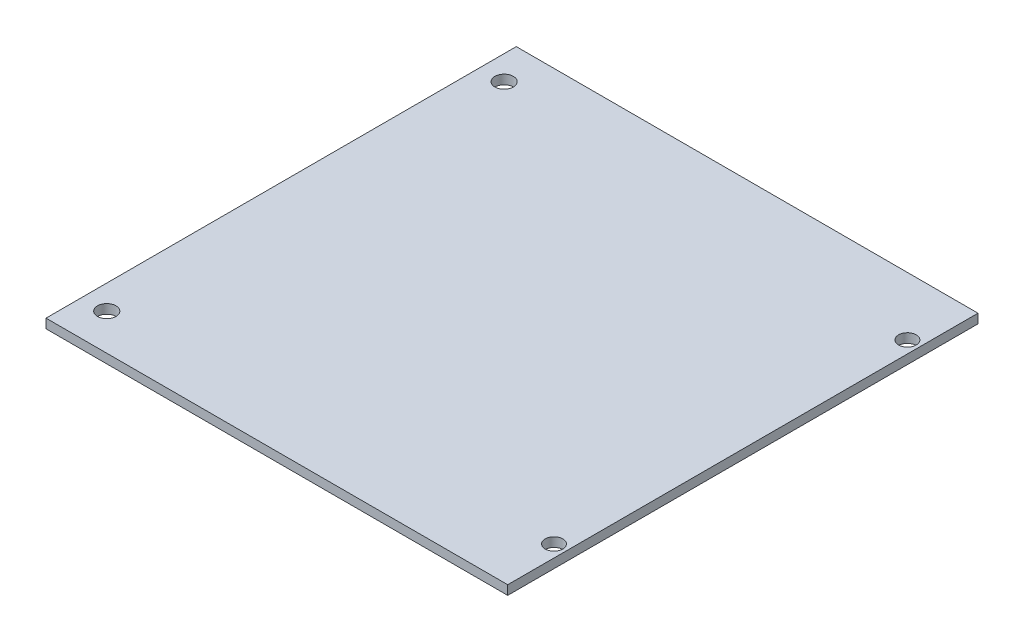
ISO-10303-21;
HEADER;
FILE_DESCRIPTION(('STEP AP214'),'2;1');
FILE_NAME('part.step','',(''),(''),'','','');
FILE_SCHEMA(('AUTOMOTIVE_DESIGN { 1 0 10303 214 1 1 1 1 }'));
ENDSEC;
DATA;
#1=APPLICATION_CONTEXT('core data for automotive mechanical design processes');
#2=APPLICATION_PROTOCOL_DEFINITION('international standard','automotive_design',2000,#1);
#3=PRODUCT_CONTEXT('',#1,'mechanical');
#4=PRODUCT('Part','Part','',(#3));
#5=PRODUCT_RELATED_PRODUCT_CATEGORY('part','',(#4));
#6=PRODUCT_DEFINITION_FORMATION('','',#4);
#7=PRODUCT_DEFINITION_CONTEXT('part definition',#1,'design');
#8=PRODUCT_DEFINITION('design','',#6,#7);
#9=PRODUCT_DEFINITION_SHAPE('','',#8);
#10=(LENGTH_UNIT() NAMED_UNIT(*) SI_UNIT(.MILLI.,.METRE.));
#11=(NAMED_UNIT(*) PLANE_ANGLE_UNIT() SI_UNIT($,.RADIAN.));
#12=(NAMED_UNIT(*) SI_UNIT($,.STERADIAN.) SOLID_ANGLE_UNIT());
#13=UNCERTAINTY_MEASURE_WITH_UNIT(LENGTH_MEASURE(1.E-05),#10,'distance_accuracy_value','');
#14=(GEOMETRIC_REPRESENTATION_CONTEXT(3) GLOBAL_UNCERTAINTY_ASSIGNED_CONTEXT((#13)) GLOBAL_UNIT_ASSIGNED_CONTEXT((#10,
#11,#12)) REPRESENTATION_CONTEXT('',''));
#15=CARTESIAN_POINT('',(0.,0.,0.));
#16=DIRECTION('',(0.,0.,1.));
#17=DIRECTION('',(1.,0.,0.));
#18=AXIS2_PLACEMENT_3D('',#15,#16,#17);
#19=CARTESIAN_POINT('',(-71.8575234229718,1.600000102,79.0505329153605));
#20=DIRECTION('',(1.,0.,0.));
#21=DIRECTION('',(0.,0.,-1.));
#22=AXIS2_PLACEMENT_3D('',#19,#20,#21);
#23=PLANE('',#22);
#24=DIRECTION('',(0.,0.,1.));
#25=VECTOR('',#24,1.);
#26=CARTESIAN_POINT('',(-71.8575234229718,0.,79.0505329153605));
#27=LINE('',#26,#25);
#28=CARTESIAN_POINT('',(-71.8575234229718,0.,-2.22946708463949));
#29=VERTEX_POINT('',#28);
#30=CARTESIAN_POINT('',(-71.8575234229718,0.,79.0505329153605));
#31=VERTEX_POINT('',#30);
#32=EDGE_CURVE('E97',#29,#31,#27,.T.);
#33=ORIENTED_EDGE('',*,*,#32,.T.);
#34=DIRECTION('',(0.,-1.,0.));
#35=VECTOR('',#34,1.);
#36=CARTESIAN_POINT('',(-71.8575234229718,1.600000102,79.0505329153605));
#37=LINE('',#36,#35);
#38=CARTESIAN_POINT('',(-71.8575234229718,1.600000102,79.0505329153605));
#39=VERTEX_POINT('',#38);
#40=EDGE_CURVE('E11',#39,#31,#37,.T.);
#41=ORIENTED_EDGE('',*,*,#40,.F.);
#42=DIRECTION('',(0.,0.,1.));
#43=VECTOR('',#42,1.);
#44=CARTESIAN_POINT('',(-71.8575234229718,1.600000102,79.0505329153605));
#45=LINE('',#44,#43);
#46=CARTESIAN_POINT('',(-71.8575234229718,1.600000102,-2.22946708463949));
#47=VERTEX_POINT('',#46);
#48=EDGE_CURVE('E85',#47,#39,#45,.T.);
#49=ORIENTED_EDGE('',*,*,#48,.F.);
#50=DIRECTION('',(0.,-1.,0.));
#51=VECTOR('',#50,1.);
#52=CARTESIAN_POINT('',(-71.8575234229718,1.600000102,-2.22946708463949));
#53=LINE('',#52,#51);
#54=EDGE_CURVE('E93',#47,#29,#53,.T.);
#55=ORIENTED_EDGE('',*,*,#54,.T.);
#56=EDGE_LOOP('',(#33,#41,#49,#55));
#57=FACE_BOUND('',#56,.T.);
#58=ADVANCED_FACE('F34',(#57),#23,.F.);
#59=CARTESIAN_POINT('',(-71.8575234229718,1.600000102,79.0505329153605));
#60=DIRECTION('',(0.,0.,-1.));
#61=DIRECTION('',(-1.,0.,0.));
#62=AXIS2_PLACEMENT_3D('',#59,#60,#61);
#63=PLANE('',#62);
#64=DIRECTION('',(1.,0.,0.));
#65=VECTOR('',#64,1.);
#66=CARTESIAN_POINT('',(-71.8575234229718,0.,79.0505329153605));
#67=LINE('',#66,#65);
#68=CARTESIAN_POINT('',(7.9424764890282,0.,79.0505329153605));
#69=VERTEX_POINT('',#68);
#70=EDGE_CURVE('E89',#31,#69,#67,.T.);
#71=ORIENTED_EDGE('',*,*,#70,.T.);
#72=DIRECTION('',(0.,-1.,0.));
#73=VECTOR('',#72,1.);
#74=CARTESIAN_POINT('',(7.9424764890282,1.600000102,79.0505329153605));
#75=LINE('',#74,#73);
#76=CARTESIAN_POINT('',(7.9424764890282,1.600000102,79.0505329153605));
#77=VERTEX_POINT('',#76);
#78=EDGE_CURVE('E42',#77,#69,#75,.T.);
#79=ORIENTED_EDGE('',*,*,#78,.F.);
#80=DIRECTION('',(1.,0.,0.));
#81=VECTOR('',#80,1.);
#82=CARTESIAN_POINT('',(-71.8575234229718,1.600000102,79.0505329153605));
#83=LINE('',#82,#81);
#84=EDGE_CURVE('E80',#39,#77,#83,.T.);
#85=ORIENTED_EDGE('',*,*,#84,.F.);
#86=ORIENTED_EDGE('',*,*,#40,.T.);
#87=EDGE_LOOP('',(#71,#79,#85,#86));
#88=FACE_BOUND('',#87,.T.);
#89=ADVANCED_FACE('F88',(#88),#63,.F.);
#90=CARTESIAN_POINT('',(7.9424764890282,1.600000102,79.0505329153605));
#91=DIRECTION('',(-1.,0.,0.));
#92=DIRECTION('',(0.,0.,1.));
#93=AXIS2_PLACEMENT_3D('',#90,#91,#92);
#94=PLANE('',#93);
#95=DIRECTION('',(0.,0.,-1.));
#96=VECTOR('',#95,1.);
#97=CARTESIAN_POINT('',(7.9424764890282,0.,79.0505329153605));
#98=LINE('',#97,#96);
#99=CARTESIAN_POINT('',(7.9424764890282,0.,-2.22946708463949));
#100=VERTEX_POINT('',#99);
#101=EDGE_CURVE('E67',#69,#100,#98,.T.);
#102=ORIENTED_EDGE('',*,*,#101,.T.);
#103=DIRECTION('',(0.,-1.,0.));
#104=VECTOR('',#103,1.);
#105=CARTESIAN_POINT('',(7.9424764890282,1.600000102,-2.22946708463949));
#106=LINE('',#105,#104);
#107=CARTESIAN_POINT('',(7.9424764890282,1.600000102,-2.22946708463949));
#108=VERTEX_POINT('',#107);
#109=EDGE_CURVE('E90',#108,#100,#106,.T.);
#110=ORIENTED_EDGE('',*,*,#109,.F.);
#111=DIRECTION('',(0.,0.,-1.));
#112=VECTOR('',#111,1.);
#113=CARTESIAN_POINT('',(7.9424764890282,1.600000102,79.0505329153605));
#114=LINE('',#113,#112);
#115=EDGE_CURVE('E83',#77,#108,#114,.T.);
#116=ORIENTED_EDGE('',*,*,#115,.F.);
#117=ORIENTED_EDGE('',*,*,#78,.T.);
#118=EDGE_LOOP('',(#102,#110,#116,#117));
#119=FACE_BOUND('',#118,.T.);
#120=ADVANCED_FACE('F91',(#119),#94,.F.);
#121=CARTESIAN_POINT('',(-71.8575234229718,1.600000102,-2.22946708463949));
#122=DIRECTION('',(0.,0.,1.));
#123=DIRECTION('',(1.,0.,0.));
#124=AXIS2_PLACEMENT_3D('',#121,#122,#123);
#125=PLANE('',#124);
#126=DIRECTION('',(-1.,0.,0.));
#127=VECTOR('',#126,1.);
#128=CARTESIAN_POINT('',(-71.8575234229718,0.,-2.22946708463949));
#129=LINE('',#128,#127);
#130=EDGE_CURVE('E73',#100,#29,#129,.T.);
#131=ORIENTED_EDGE('',*,*,#130,.T.);
#132=ORIENTED_EDGE('',*,*,#54,.F.);
#133=DIRECTION('',(-1.,0.,0.));
#134=VECTOR('',#133,1.);
#135=CARTESIAN_POINT('',(-71.8575234229718,1.600000102,-2.22946708463949));
#136=LINE('',#135,#134);
#137=EDGE_CURVE('E50',#108,#47,#136,.T.);
#138=ORIENTED_EDGE('',*,*,#137,.F.);
#139=ORIENTED_EDGE('',*,*,#109,.T.);
#140=EDGE_LOOP('',(#131,#132,#138,#139));
#141=FACE_BOUND('',#140,.T.);
#142=ADVANCED_FACE('F105',(#141),#125,.F.);
#143=CARTESIAN_POINT('',(0.,1.600000102,0.));
#144=DIRECTION('',(0.,-1.,0.));
#145=DIRECTION('',(0.,0.,-1.));
#146=AXIS2_PLACEMENT_3D('',#143,#144,#145);
#147=PLANE('',#146);
#148=CARTESIAN_POINT('',(-67.6575282229718,1.600000102,4.07053291536051));
#149=DIRECTION('',(0.,1.,0.));
#150=DIRECTION('',(0.,0.,1.));
#151=AXIS2_PLACEMENT_3D('',#148,#149,#150);
#152=CIRCLE('',#151,1.60000000000001);
#153=CARTESIAN_POINT('',(-67.6575282229718,1.600000102,2.47053291536051));
#154=VERTEX_POINT('',#153);
#155=EDGE_CURVE('E126',#154,#154,#152,.T.);
#156=ORIENTED_EDGE('',*,*,#155,.F.);
#157=EDGE_LOOP('',(#156));
#158=FACE_BOUND('',#157,.T.);
#159=CARTESIAN_POINT('',(-67.6575282229718,1.600000102,72.7505329153605));
#160=DIRECTION('',(0.,-1.,0.));
#161=DIRECTION('',(0.,0.,-1.));
#162=AXIS2_PLACEMENT_3D('',#159,#160,#161);
#163=CIRCLE('',#162,1.60000000000001);
#164=CARTESIAN_POINT('',(-67.6575282229718,1.600000102,71.1505329153605));
#165=VERTEX_POINT('',#164);
#166=EDGE_CURVE('E120',#165,#165,#163,.T.);
#167=ORIENTED_EDGE('',*,*,#166,.T.);
#168=EDGE_LOOP('',(#167));
#169=FACE_BOUND('',#168,.T.);
#170=CARTESIAN_POINT('',(5.8424764890282,1.600000102,7.87053291536051));
#171=DIRECTION('',(0.,-1.,0.));
#172=DIRECTION('',(0.,0.,-1.));
#173=AXIS2_PLACEMENT_3D('',#170,#171,#172);
#174=CIRCLE('',#173,1.524);
#175=CARTESIAN_POINT('',(5.8424764890282,1.600000102,9.39453291536051));
#176=VERTEX_POINT('',#175);
#177=EDGE_CURVE('E117',#176,#176,#174,.T.);
#178=ORIENTED_EDGE('',*,*,#177,.T.);
#179=EDGE_LOOP('',(#178));
#180=FACE_BOUND('',#179,.T.);
#181=CARTESIAN_POINT('',(5.8424764890282,1.600000102,68.9505329153605));
#182=DIRECTION('',(0.,1.,0.));
#183=DIRECTION('',(0.,0.,1.));
#184=AXIS2_PLACEMENT_3D('',#181,#182,#183);
#185=CIRCLE('',#184,1.524);
#186=CARTESIAN_POINT('',(5.8424764890282,1.600000102,70.4745329153605));
#187=VERTEX_POINT('',#186);
#188=EDGE_CURVE('E111',#187,#187,#185,.T.);
#189=ORIENTED_EDGE('',*,*,#188,.F.);
#190=EDGE_LOOP('',(#189));
#191=FACE_BOUND('',#190,.T.);
#192=ORIENTED_EDGE('',*,*,#48,.T.);
#193=ORIENTED_EDGE('',*,*,#84,.T.);
#194=ORIENTED_EDGE('',*,*,#115,.T.);
#195=ORIENTED_EDGE('',*,*,#137,.T.);
#196=EDGE_LOOP('',(#192,#193,#194,#195));
#197=FACE_BOUND('',#196,.T.);
#198=ADVANCED_FACE('F81',(#158,#169,#180,#191,#197),#147,.F.);
#199=CARTESIAN_POINT('',(0.,0.,0.));
#200=DIRECTION('',(0.,-1.,0.));
#201=DIRECTION('',(0.,0.,-1.));
#202=AXIS2_PLACEMENT_3D('',#199,#200,#201);
#203=PLANE('',#202);
#204=CARTESIAN_POINT('',(-67.6575282229718,0.,4.07053291536051));
#205=DIRECTION('',(0.,1.,0.));
#206=DIRECTION('',(0.,0.,1.));
#207=AXIS2_PLACEMENT_3D('',#204,#205,#206);
#208=CIRCLE('',#207,1.60000000000001);
#209=CARTESIAN_POINT('',(-67.6575282229718,0.,2.47053291536051));
#210=VERTEX_POINT('',#209);
#211=EDGE_CURVE('E129',#210,#210,#208,.T.);
#212=ORIENTED_EDGE('',*,*,#211,.T.);
#213=EDGE_LOOP('',(#212));
#214=FACE_BOUND('',#213,.T.);
#215=CARTESIAN_POINT('',(-67.6575282229718,0.,72.7505329153605));
#216=DIRECTION('',(0.,-1.,0.));
#217=DIRECTION('',(0.,0.,-1.));
#218=AXIS2_PLACEMENT_3D('',#215,#216,#217);
#219=CIRCLE('',#218,1.60000000000001);
#220=CARTESIAN_POINT('',(-67.6575282229718,0.,71.1505329153605));
#221=VERTEX_POINT('',#220);
#222=EDGE_CURVE('E123',#221,#221,#219,.T.);
#223=ORIENTED_EDGE('',*,*,#222,.F.);
#224=EDGE_LOOP('',(#223));
#225=FACE_BOUND('',#224,.T.);
#226=CARTESIAN_POINT('',(5.8424764890282,0.,7.87053291536051));
#227=DIRECTION('',(0.,-1.,0.));
#228=DIRECTION('',(0.,0.,-1.));
#229=AXIS2_PLACEMENT_3D('',#226,#227,#228);
#230=CIRCLE('',#229,1.524);
#231=CARTESIAN_POINT('',(5.8424764890282,0.,9.39453291536051));
#232=VERTEX_POINT('',#231);
#233=EDGE_CURVE('E114',#232,#232,#230,.T.);
#234=ORIENTED_EDGE('',*,*,#233,.F.);
#235=EDGE_LOOP('',(#234));
#236=FACE_BOUND('',#235,.T.);
#237=CARTESIAN_POINT('',(5.8424764890282,0.,68.9505329153605));
#238=DIRECTION('',(0.,1.,0.));
#239=DIRECTION('',(0.,0.,1.));
#240=AXIS2_PLACEMENT_3D('',#237,#238,#239);
#241=CIRCLE('',#240,1.524);
#242=CARTESIAN_POINT('',(5.8424764890282,0.,70.4745329153605));
#243=VERTEX_POINT('',#242);
#244=EDGE_CURVE('E100',#243,#243,#241,.T.);
#245=ORIENTED_EDGE('',*,*,#244,.T.);
#246=EDGE_LOOP('',(#245));
#247=FACE_BOUND('',#246,.T.);
#248=ORIENTED_EDGE('',*,*,#32,.F.);
#249=ORIENTED_EDGE('',*,*,#130,.F.);
#250=ORIENTED_EDGE('',*,*,#101,.F.);
#251=ORIENTED_EDGE('',*,*,#70,.F.);
#252=EDGE_LOOP('',(#248,#249,#250,#251));
#253=FACE_BOUND('',#252,.T.);
#254=ADVANCED_FACE('F108',(#214,#225,#236,#247,#253),#203,.T.);
#255=CARTESIAN_POINT('',(5.8424764890282,0.,68.9505329153605));
#256=DIRECTION('',(0.,1.,0.));
#257=DIRECTION('',(0.,0.,1.));
#258=AXIS2_PLACEMENT_3D('',#255,#256,#257);
#259=CYLINDRICAL_SURFACE('',#258,1.524);
#260=CARTESIAN_POINT('',(5.8424764890282,0.,70.4745329153605));
#261=CARTESIAN_POINT('',(5.8424764890282,0.0166666677291667,70.4745329153605));
#262=CARTESIAN_POINT('',(5.8424764890282,0.0333333354583333,70.4745329153605));
#263=CARTESIAN_POINT('',(5.8424764890282,0.0666666709166667,70.4745329153605));
#264=CARTESIAN_POINT('',(5.8424764890282,0.0833333386458333,70.4745329153605));
#265=CARTESIAN_POINT('',(5.8424764890282,0.116666674104167,70.4745329153605));
#266=CARTESIAN_POINT('',(5.8424764890282,0.133333341833333,70.4745329153605));
#267=CARTESIAN_POINT('',(5.8424764890282,0.166666677291667,70.4745329153605));
#268=CARTESIAN_POINT('',(5.8424764890282,0.183333345020833,70.4745329153605));
#269=CARTESIAN_POINT('',(5.8424764890282,0.216666680479167,70.4745329153605));
#270=CARTESIAN_POINT('',(5.8424764890282,0.233333348208333,70.4745329153605));
#271=CARTESIAN_POINT('',(5.8424764890282,0.266666683666667,70.4745329153605));
#272=CARTESIAN_POINT('',(5.8424764890282,0.283333351395833,70.4745329153605));
#273=CARTESIAN_POINT('',(5.8424764890282,0.316666686854167,70.4745329153605));
#274=CARTESIAN_POINT('',(5.8424764890282,0.333333354583333,70.4745329153605));
#275=CARTESIAN_POINT('',(5.8424764890282,0.366666690041667,70.4745329153605));
#276=CARTESIAN_POINT('',(5.8424764890282,0.383333357770833,70.4745329153605));
#277=CARTESIAN_POINT('',(5.8424764890282,0.416666693229167,70.4745329153605));
#278=CARTESIAN_POINT('',(5.8424764890282,0.433333360958333,70.4745329153605));
#279=CARTESIAN_POINT('',(5.8424764890282,0.466666696416667,70.4745329153605));
#280=CARTESIAN_POINT('',(5.8424764890282,0.483333364145833,70.4745329153605));
#281=CARTESIAN_POINT('',(5.8424764890282,0.516666699604167,70.4745329153605));
#282=CARTESIAN_POINT('',(5.8424764890282,0.533333367333333,70.4745329153605));
#283=CARTESIAN_POINT('',(5.8424764890282,0.566666702791667,70.4745329153605));
#284=CARTESIAN_POINT('',(5.8424764890282,0.583333370520833,70.4745329153605));
#285=CARTESIAN_POINT('',(5.8424764890282,0.616666705979167,70.4745329153605));
#286=CARTESIAN_POINT('',(5.8424764890282,0.633333373708333,70.4745329153605));
#287=CARTESIAN_POINT('',(5.8424764890282,0.666666709166667,70.4745329153605));
#288=CARTESIAN_POINT('',(5.8424764890282,0.683333376895833,70.4745329153605));
#289=CARTESIAN_POINT('',(5.8424764890282,0.716666712354167,70.4745329153605));
#290=CARTESIAN_POINT('',(5.8424764890282,0.733333380083333,70.4745329153605));
#291=CARTESIAN_POINT('',(5.8424764890282,0.766666715541667,70.4745329153605));
#292=CARTESIAN_POINT('',(5.8424764890282,0.783333383270833,70.4745329153605));
#293=CARTESIAN_POINT('',(5.8424764890282,0.816666718729167,70.4745329153605));
#294=CARTESIAN_POINT('',(5.8424764890282,0.833333386458333,70.4745329153605));
#295=CARTESIAN_POINT('',(5.8424764890282,0.866666721916666,70.4745329153605));
#296=CARTESIAN_POINT('',(5.8424764890282,0.883333389645833,70.4745329153605));
#297=CARTESIAN_POINT('',(5.8424764890282,0.916666725104166,70.4745329153605));
#298=CARTESIAN_POINT('',(5.8424764890282,0.933333392833333,70.4745329153605));
#299=CARTESIAN_POINT('',(5.8424764890282,0.966666728291666,70.4745329153605));
#300=CARTESIAN_POINT('',(5.8424764890282,0.983333396020833,70.4745329153605));
#301=CARTESIAN_POINT('',(5.8424764890282,1.01666673147917,70.4745329153605));
#302=CARTESIAN_POINT('',(5.8424764890282,1.03333339920833,70.4745329153605));
#303=CARTESIAN_POINT('',(5.8424764890282,1.06666673466667,70.4745329153605));
#304=CARTESIAN_POINT('',(5.8424764890282,1.08333340239583,70.4745329153605));
#305=CARTESIAN_POINT('',(5.8424764890282,1.11666673785417,70.4745329153605));
#306=CARTESIAN_POINT('',(5.8424764890282,1.13333340558333,70.4745329153605));
#307=CARTESIAN_POINT('',(5.8424764890282,1.16666674104167,70.4745329153605));
#308=CARTESIAN_POINT('',(5.8424764890282,1.18333340877083,70.4745329153605));
#309=CARTESIAN_POINT('',(5.8424764890282,1.21666674422917,70.4745329153605));
#310=CARTESIAN_POINT('',(5.8424764890282,1.23333341195833,70.4745329153605));
#311=CARTESIAN_POINT('',(5.8424764890282,1.26666674741667,70.4745329153605));
#312=CARTESIAN_POINT('',(5.8424764890282,1.28333341514583,70.4745329153605));
#313=CARTESIAN_POINT('',(5.8424764890282,1.31666675060417,70.4745329153605));
#314=CARTESIAN_POINT('',(5.8424764890282,1.33333341833333,70.4745329153605));
#315=CARTESIAN_POINT('',(5.8424764890282,1.36666675379167,70.4745329153605));
#316=CARTESIAN_POINT('',(5.8424764890282,1.38333342152083,70.4745329153605));
#317=CARTESIAN_POINT('',(5.8424764890282,1.41666675697917,70.4745329153605));
#318=CARTESIAN_POINT('',(5.8424764890282,1.43333342470833,70.4745329153605));
#319=CARTESIAN_POINT('',(5.8424764890282,1.46666676016667,70.4745329153605));
#320=CARTESIAN_POINT('',(5.8424764890282,1.48333342789583,70.4745329153605));
#321=CARTESIAN_POINT('',(5.8424764890282,1.51666676335417,70.4745329153605));
#322=CARTESIAN_POINT('',(5.8424764890282,1.53333343108333,70.4745329153605));
#323=CARTESIAN_POINT('',(5.8424764890282,1.56666676654167,70.4745329153605));
#324=CARTESIAN_POINT('',(5.8424764890282,1.58333343427083,70.4745329153605));
#325=CARTESIAN_POINT('',(5.8424764890282,1.600000102,70.4745329153605));
#326=B_SPLINE_CURVE_WITH_KNOTS('',3,(#260,#261,#262,#263,#264,#265,#266,#267,#268,#269,#270,
#271,#272,#273,#274,#275,#276,#277,#278,#279,#280,#281,#282,#283,#284,#285,#286,#287,#288,#289,
#290,#291,#292,#293,#294,#295,#296,#297,#298,#299,#300,#301,#302,#303,#304,#305,#306,#307,#308,
#309,#310,#311,#312,#313,#314,#315,#316,#317,#318,#319,#320,#321,#322,#323,#324,#325),
.UNSPECIFIED.,.F.,.F.,(4,2,2,2,2,2,2,2,2,2,2,2,2,2,2,2,2,2,2,2,2,2,2,2,2,2,2,2,2,2,2,2,4),(0.,
0.0500000031875,0.100000006375,0.1500000095625,0.20000001275,0.2500000159375,0.300000019125,
0.3500000223125,0.4000000255,0.4500000286875,0.500000031875,0.5500000350625,0.60000003825,
0.6500000414375,0.700000044625,0.7500000478125,0.800000051,0.8500000541875,0.900000057375,
0.9500000605625,1.00000006375,1.0500000669375,1.100000070125,1.1500000733125,1.2000000765,
1.2500000796875,1.300000082875,1.3500000860625,1.40000008925,1.4500000924375,1.500000095625,
1.5500000988125,1.600000102),.UNSPECIFIED.);
#327=EDGE_CURVE('BSEAM147',#243,#187,#326,.T.);
#328=ORIENTED_EDGE('',*,*,#244,.F.);
#329=ORIENTED_EDGE('',*,*,#188,.T.);
#330=ORIENTED_EDGE('',*,*,#327,.T.);
#331=ORIENTED_EDGE('',*,*,#327,.F.);
#332=EDGE_LOOP('',(#328,#330,#329,#331));
#333=FACE_BOUND('',#332,.T.);
#334=ADVANCED_FACE('F147',(#333),#259,.F.);
#335=CARTESIAN_POINT('',(5.8424764890282,0.,7.87053291536051));
#336=DIRECTION('',(0.,1.,0.));
#337=DIRECTION('',(0.,0.,1.));
#338=AXIS2_PLACEMENT_3D('',#335,#336,#337);
#339=CYLINDRICAL_SURFACE('',#338,1.524);
#340=CARTESIAN_POINT('',(5.8424764890282,0.,9.39453291536051));
#341=CARTESIAN_POINT('',(5.8424764890282,0.0166666677291667,9.39453291536051));
#342=CARTESIAN_POINT('',(5.8424764890282,0.0333333354583333,9.39453291536051));
#343=CARTESIAN_POINT('',(5.8424764890282,0.0666666709166667,9.39453291536051));
#344=CARTESIAN_POINT('',(5.8424764890282,0.0833333386458333,9.39453291536051));
#345=CARTESIAN_POINT('',(5.8424764890282,0.116666674104167,9.39453291536051));
#346=CARTESIAN_POINT('',(5.8424764890282,0.133333341833333,9.39453291536051));
#347=CARTESIAN_POINT('',(5.8424764890282,0.166666677291667,9.39453291536051));
#348=CARTESIAN_POINT('',(5.8424764890282,0.183333345020833,9.39453291536051));
#349=CARTESIAN_POINT('',(5.8424764890282,0.216666680479167,9.39453291536051));
#350=CARTESIAN_POINT('',(5.8424764890282,0.233333348208333,9.39453291536051));
#351=CARTESIAN_POINT('',(5.8424764890282,0.266666683666667,9.39453291536051));
#352=CARTESIAN_POINT('',(5.8424764890282,0.283333351395833,9.39453291536051));
#353=CARTESIAN_POINT('',(5.8424764890282,0.316666686854167,9.39453291536051));
#354=CARTESIAN_POINT('',(5.8424764890282,0.333333354583333,9.39453291536051));
#355=CARTESIAN_POINT('',(5.8424764890282,0.366666690041667,9.39453291536051));
#356=CARTESIAN_POINT('',(5.8424764890282,0.383333357770833,9.39453291536051));
#357=CARTESIAN_POINT('',(5.8424764890282,0.416666693229167,9.39453291536051));
#358=CARTESIAN_POINT('',(5.8424764890282,0.433333360958333,9.39453291536051));
#359=CARTESIAN_POINT('',(5.8424764890282,0.466666696416667,9.39453291536051));
#360=CARTESIAN_POINT('',(5.8424764890282,0.483333364145833,9.39453291536051));
#361=CARTESIAN_POINT('',(5.8424764890282,0.516666699604167,9.39453291536051));
#362=CARTESIAN_POINT('',(5.8424764890282,0.533333367333333,9.39453291536051));
#363=CARTESIAN_POINT('',(5.8424764890282,0.566666702791667,9.39453291536051));
#364=CARTESIAN_POINT('',(5.8424764890282,0.583333370520833,9.39453291536051));
#365=CARTESIAN_POINT('',(5.8424764890282,0.616666705979167,9.39453291536051));
#366=CARTESIAN_POINT('',(5.8424764890282,0.633333373708333,9.39453291536051));
#367=CARTESIAN_POINT('',(5.8424764890282,0.666666709166667,9.39453291536051));
#368=CARTESIAN_POINT('',(5.8424764890282,0.683333376895833,9.39453291536051));
#369=CARTESIAN_POINT('',(5.8424764890282,0.716666712354167,9.39453291536051));
#370=CARTESIAN_POINT('',(5.8424764890282,0.733333380083333,9.39453291536051));
#371=CARTESIAN_POINT('',(5.8424764890282,0.766666715541667,9.39453291536051));
#372=CARTESIAN_POINT('',(5.8424764890282,0.783333383270833,9.39453291536051));
#373=CARTESIAN_POINT('',(5.8424764890282,0.816666718729167,9.39453291536051));
#374=CARTESIAN_POINT('',(5.8424764890282,0.833333386458333,9.39453291536051));
#375=CARTESIAN_POINT('',(5.8424764890282,0.866666721916667,9.39453291536051));
#376=CARTESIAN_POINT('',(5.8424764890282,0.883333389645833,9.39453291536051));
#377=CARTESIAN_POINT('',(5.8424764890282,0.916666725104167,9.39453291536051));
#378=CARTESIAN_POINT('',(5.8424764890282,0.933333392833333,9.39453291536051));
#379=CARTESIAN_POINT('',(5.8424764890282,0.966666728291667,9.39453291536051));
#380=CARTESIAN_POINT('',(5.8424764890282,0.983333396020833,9.39453291536051));
#381=CARTESIAN_POINT('',(5.8424764890282,1.01666673147917,9.39453291536051));
#382=CARTESIAN_POINT('',(5.8424764890282,1.03333339920833,9.39453291536051));
#383=CARTESIAN_POINT('',(5.8424764890282,1.06666673466667,9.39453291536051));
#384=CARTESIAN_POINT('',(5.8424764890282,1.08333340239583,9.39453291536051));
#385=CARTESIAN_POINT('',(5.8424764890282,1.11666673785417,9.39453291536051));
#386=CARTESIAN_POINT('',(5.8424764890282,1.13333340558333,9.39453291536051));
#387=CARTESIAN_POINT('',(5.8424764890282,1.16666674104167,9.39453291536051));
#388=CARTESIAN_POINT('',(5.8424764890282,1.18333340877083,9.39453291536051));
#389=CARTESIAN_POINT('',(5.8424764890282,1.21666674422917,9.39453291536051));
#390=CARTESIAN_POINT('',(5.8424764890282,1.23333341195833,9.39453291536051));
#391=CARTESIAN_POINT('',(5.8424764890282,1.26666674741667,9.39453291536051));
#392=CARTESIAN_POINT('',(5.8424764890282,1.28333341514583,9.39453291536051));
#393=CARTESIAN_POINT('',(5.8424764890282,1.31666675060417,9.39453291536051));
#394=CARTESIAN_POINT('',(5.8424764890282,1.33333341833333,9.39453291536051));
#395=CARTESIAN_POINT('',(5.8424764890282,1.36666675379167,9.39453291536051));
#396=CARTESIAN_POINT('',(5.8424764890282,1.38333342152083,9.39453291536051));
#397=CARTESIAN_POINT('',(5.8424764890282,1.41666675697917,9.39453291536051));
#398=CARTESIAN_POINT('',(5.8424764890282,1.43333342470833,9.39453291536051));
#399=CARTESIAN_POINT('',(5.8424764890282,1.46666676016667,9.39453291536051));
#400=CARTESIAN_POINT('',(5.8424764890282,1.48333342789583,9.39453291536051));
#401=CARTESIAN_POINT('',(5.8424764890282,1.51666676335417,9.39453291536051));
#402=CARTESIAN_POINT('',(5.8424764890282,1.53333343108333,9.39453291536051));
#403=CARTESIAN_POINT('',(5.8424764890282,1.56666676654167,9.39453291536051));
#404=CARTESIAN_POINT('',(5.8424764890282,1.58333343427083,9.39453291536051));
#405=CARTESIAN_POINT('',(5.8424764890282,1.600000102,9.39453291536051));
#406=B_SPLINE_CURVE_WITH_KNOTS('',3,(#340,#341,#342,#343,#344,#345,#346,#347,#348,#349,#350,
#351,#352,#353,#354,#355,#356,#357,#358,#359,#360,#361,#362,#363,#364,#365,#366,#367,#368,#369,
#370,#371,#372,#373,#374,#375,#376,#377,#378,#379,#380,#381,#382,#383,#384,#385,#386,#387,#388,
#389,#390,#391,#392,#393,#394,#395,#396,#397,#398,#399,#400,#401,#402,#403,#404,#405),
.UNSPECIFIED.,.F.,.F.,(4,2,2,2,2,2,2,2,2,2,2,2,2,2,2,2,2,2,2,2,2,2,2,2,2,2,2,2,2,2,2,2,4),(0.,
0.0500000031875,0.100000006375,0.1500000095625,0.20000001275,0.2500000159375,0.300000019125,
0.3500000223125,0.4000000255,0.4500000286875,0.500000031875,0.5500000350625,0.60000003825,
0.6500000414375,0.700000044625,0.7500000478125,0.800000051,0.8500000541875,0.900000057375,
0.9500000605625,1.00000006375,1.0500000669375,1.100000070125,1.1500000733125,1.2000000765,
1.2500000796875,1.300000082875,1.3500000860625,1.40000008925,1.4500000924375,1.500000095625,
1.5500000988125,1.600000102),.UNSPECIFIED.);
#407=EDGE_CURVE('BSEAM149',#232,#176,#406,.T.);
#408=ORIENTED_EDGE('',*,*,#233,.T.);
#409=ORIENTED_EDGE('',*,*,#177,.F.);
#410=ORIENTED_EDGE('',*,*,#407,.T.);
#411=ORIENTED_EDGE('',*,*,#407,.F.);
#412=EDGE_LOOP('',(#408,#410,#409,#411));
#413=FACE_BOUND('',#412,.T.);
#414=ADVANCED_FACE('F149',(#413),#339,.F.);
#415=CARTESIAN_POINT('',(-67.6575282229718,1.600000102,72.7505329153605));
#416=DIRECTION('',(0.,-1.,0.));
#417=DIRECTION('',(0.,0.,-1.));
#418=AXIS2_PLACEMENT_3D('',#415,#416,#417);
#419=CYLINDRICAL_SURFACE('',#418,1.60000000000001);
#420=CARTESIAN_POINT('',(-67.6575282229718,1.600000102,71.1505329153605));
#421=CARTESIAN_POINT('',(-67.6575282229718,1.58333343427083,71.1505329153605));
#422=CARTESIAN_POINT('',(-67.6575282229718,1.56666676654167,71.1505329153605));
#423=CARTESIAN_POINT('',(-67.6575282229718,1.53333343108333,71.1505329153605));
#424=CARTESIAN_POINT('',(-67.6575282229718,1.51666676335417,71.1505329153605));
#425=CARTESIAN_POINT('',(-67.6575282229718,1.48333342789583,71.1505329153605));
#426=CARTESIAN_POINT('',(-67.6575282229718,1.46666676016667,71.1505329153605));
#427=CARTESIAN_POINT('',(-67.6575282229718,1.43333342470833,71.1505329153605));
#428=CARTESIAN_POINT('',(-67.6575282229718,1.41666675697917,71.1505329153605));
#429=CARTESIAN_POINT('',(-67.6575282229718,1.38333342152083,71.1505329153605));
#430=CARTESIAN_POINT('',(-67.6575282229718,1.36666675379167,71.1505329153605));
#431=CARTESIAN_POINT('',(-67.6575282229718,1.33333341833333,71.1505329153605));
#432=CARTESIAN_POINT('',(-67.6575282229718,1.31666675060417,71.1505329153605));
#433=CARTESIAN_POINT('',(-67.6575282229718,1.28333341514583,71.1505329153605));
#434=CARTESIAN_POINT('',(-67.6575282229718,1.26666674741667,71.1505329153605));
#435=CARTESIAN_POINT('',(-67.6575282229718,1.23333341195833,71.1505329153605));
#436=CARTESIAN_POINT('',(-67.6575282229718,1.21666674422917,71.1505329153605));
#437=CARTESIAN_POINT('',(-67.6575282229718,1.18333340877083,71.1505329153605));
#438=CARTESIAN_POINT('',(-67.6575282229718,1.16666674104167,71.1505329153605));
#439=CARTESIAN_POINT('',(-67.6575282229718,1.13333340558333,71.1505329153605));
#440=CARTESIAN_POINT('',(-67.6575282229718,1.11666673785417,71.1505329153605));
#441=CARTESIAN_POINT('',(-67.6575282229718,1.08333340239583,71.1505329153605));
#442=CARTESIAN_POINT('',(-67.6575282229718,1.06666673466667,71.1505329153605));
#443=CARTESIAN_POINT('',(-67.6575282229718,1.03333339920833,71.1505329153605));
#444=CARTESIAN_POINT('',(-67.6575282229718,1.01666673147917,71.1505329153605));
#445=CARTESIAN_POINT('',(-67.6575282229718,0.983333396020833,71.1505329153605));
#446=CARTESIAN_POINT('',(-67.6575282229718,0.966666728291667,71.1505329153605));
#447=CARTESIAN_POINT('',(-67.6575282229718,0.933333392833333,71.1505329153605));
#448=CARTESIAN_POINT('',(-67.6575282229718,0.916666725104167,71.1505329153605));
#449=CARTESIAN_POINT('',(-67.6575282229718,0.883333389645833,71.1505329153605));
#450=CARTESIAN_POINT('',(-67.6575282229718,0.866666721916667,71.1505329153605));
#451=CARTESIAN_POINT('',(-67.6575282229718,0.833333386458333,71.1505329153605));
#452=CARTESIAN_POINT('',(-67.6575282229718,0.816666718729167,71.1505329153605));
#453=CARTESIAN_POINT('',(-67.6575282229718,0.783333383270833,71.1505329153605));
#454=CARTESIAN_POINT('',(-67.6575282229718,0.766666715541667,71.1505329153605));
#455=CARTESIAN_POINT('',(-67.6575282229718,0.733333380083333,71.1505329153605));
#456=CARTESIAN_POINT('',(-67.6575282229718,0.716666712354167,71.1505329153605));
#457=CARTESIAN_POINT('',(-67.6575282229718,0.683333376895833,71.1505329153605));
#458=CARTESIAN_POINT('',(-67.6575282229718,0.666666709166667,71.1505329153605));
#459=CARTESIAN_POINT('',(-67.6575282229718,0.633333373708333,71.1505329153605));
#460=CARTESIAN_POINT('',(-67.6575282229718,0.616666705979167,71.1505329153605));
#461=CARTESIAN_POINT('',(-67.6575282229718,0.583333370520834,71.1505329153605));
#462=CARTESIAN_POINT('',(-67.6575282229718,0.566666702791667,71.1505329153605));
#463=CARTESIAN_POINT('',(-67.6575282229718,0.533333367333334,71.1505329153605));
#464=CARTESIAN_POINT('',(-67.6575282229718,0.516666699604167,71.1505329153605));
#465=CARTESIAN_POINT('',(-67.6575282229718,0.483333364145834,71.1505329153605));
#466=CARTESIAN_POINT('',(-67.6575282229718,0.466666696416667,71.1505329153605));
#467=CARTESIAN_POINT('',(-67.6575282229718,0.433333360958334,71.1505329153605));
#468=CARTESIAN_POINT('',(-67.6575282229718,0.416666693229167,71.1505329153605));
#469=CARTESIAN_POINT('',(-67.6575282229718,0.383333357770834,71.1505329153605));
#470=CARTESIAN_POINT('',(-67.6575282229718,0.366666690041667,71.1505329153605));
#471=CARTESIAN_POINT('',(-67.6575282229718,0.333333354583334,71.1505329153605));
#472=CARTESIAN_POINT('',(-67.6575282229718,0.316666686854167,71.1505329153605));
#473=CARTESIAN_POINT('',(-67.6575282229718,0.283333351395834,71.1505329153605));
#474=CARTESIAN_POINT('',(-67.6575282229718,0.266666683666667,71.1505329153605));
#475=CARTESIAN_POINT('',(-67.6575282229718,0.233333348208334,71.1505329153605));
#476=CARTESIAN_POINT('',(-67.6575282229718,0.216666680479167,71.1505329153605));
#477=CARTESIAN_POINT('',(-67.6575282229718,0.183333345020834,71.1505329153605));
#478=CARTESIAN_POINT('',(-67.6575282229718,0.166666677291667,71.1505329153605));
#479=CARTESIAN_POINT('',(-67.6575282229718,0.133333341833334,71.1505329153605));
#480=CARTESIAN_POINT('',(-67.6575282229718,0.116666674104167,71.1505329153605));
#481=CARTESIAN_POINT('',(-67.6575282229718,0.0833333386458336,71.1505329153605));
#482=CARTESIAN_POINT('',(-67.6575282229718,0.0666666709166669,71.1505329153605));
#483=CARTESIAN_POINT('',(-67.6575282229718,0.0333333354583336,71.1505329153605));
#484=CARTESIAN_POINT('',(-67.6575282229718,0.0166666677291669,71.1505329153605));
#485=CARTESIAN_POINT('',(-67.6575282229718,0.,71.1505329153605));
#486=B_SPLINE_CURVE_WITH_KNOTS('',3,(#420,#421,#422,#423,#424,#425,#426,#427,#428,#429,#430,
#431,#432,#433,#434,#435,#436,#437,#438,#439,#440,#441,#442,#443,#444,#445,#446,#447,#448,#449,
#450,#451,#452,#453,#454,#455,#456,#457,#458,#459,#460,#461,#462,#463,#464,#465,#466,#467,#468,
#469,#470,#471,#472,#473,#474,#475,#476,#477,#478,#479,#480,#481,#482,#483,#484,#485),
.UNSPECIFIED.,.F.,.F.,(4,2,2,2,2,2,2,2,2,2,2,2,2,2,2,2,2,2,2,2,2,2,2,2,2,2,2,2,2,2,2,2,4),(0.,
0.0500000031875001,0.100000006375,0.1500000095625,0.20000001275,0.2500000159375,0.300000019125,
0.3500000223125,0.4000000255,0.4500000286875,0.500000031875,0.5500000350625,0.60000003825,
0.6500000414375,0.700000044625,0.7500000478125,0.800000051,0.8500000541875,0.900000057375,
0.9500000605625,1.00000006375,1.0500000669375,1.100000070125,1.1500000733125,1.2000000765,
1.2500000796875,1.300000082875,1.3500000860625,1.40000008925,1.4500000924375,1.500000095625,
1.5500000988125,1.600000102),.UNSPECIFIED.);
#487=EDGE_CURVE('BSEAM156',#165,#221,#486,.T.);
#488=ORIENTED_EDGE('',*,*,#166,.F.);
#489=ORIENTED_EDGE('',*,*,#222,.T.);
#490=ORIENTED_EDGE('',*,*,#487,.T.);
#491=ORIENTED_EDGE('',*,*,#487,.F.);
#492=EDGE_LOOP('',(#488,#490,#489,#491));
#493=FACE_BOUND('',#492,.T.);
#494=ADVANCED_FACE('F156',(#493),#419,.F.);
#495=CARTESIAN_POINT('',(-67.6575282229718,1.600000102,4.07053291536051));
#496=DIRECTION('',(0.,-1.,0.));
#497=DIRECTION('',(0.,0.,-1.));
#498=AXIS2_PLACEMENT_3D('',#495,#496,#497);
#499=CYLINDRICAL_SURFACE('',#498,1.60000000000001);
#500=CARTESIAN_POINT('',(-67.6575282229718,1.600000102,2.47053291536051));
#501=CARTESIAN_POINT('',(-67.6575282229718,1.58333343427083,2.47053291536051));
#502=CARTESIAN_POINT('',(-67.6575282229718,1.56666676654167,2.47053291536051));
#503=CARTESIAN_POINT('',(-67.6575282229718,1.53333343108333,2.47053291536051));
#504=CARTESIAN_POINT('',(-67.6575282229718,1.51666676335417,2.47053291536051));
#505=CARTESIAN_POINT('',(-67.6575282229718,1.48333342789583,2.47053291536051));
#506=CARTESIAN_POINT('',(-67.6575282229718,1.46666676016667,2.47053291536051));
#507=CARTESIAN_POINT('',(-67.6575282229718,1.43333342470833,2.47053291536051));
#508=CARTESIAN_POINT('',(-67.6575282229718,1.41666675697917,2.47053291536051));
#509=CARTESIAN_POINT('',(-67.6575282229718,1.38333342152083,2.47053291536051));
#510=CARTESIAN_POINT('',(-67.6575282229718,1.36666675379167,2.47053291536051));
#511=CARTESIAN_POINT('',(-67.6575282229718,1.33333341833333,2.47053291536051));
#512=CARTESIAN_POINT('',(-67.6575282229718,1.31666675060417,2.47053291536051));
#513=CARTESIAN_POINT('',(-67.6575282229718,1.28333341514583,2.47053291536051));
#514=CARTESIAN_POINT('',(-67.6575282229718,1.26666674741667,2.47053291536051));
#515=CARTESIAN_POINT('',(-67.6575282229718,1.23333341195833,2.47053291536051));
#516=CARTESIAN_POINT('',(-67.6575282229718,1.21666674422917,2.47053291536051));
#517=CARTESIAN_POINT('',(-67.6575282229718,1.18333340877083,2.47053291536051));
#518=CARTESIAN_POINT('',(-67.6575282229718,1.16666674104167,2.47053291536051));
#519=CARTESIAN_POINT('',(-67.6575282229718,1.13333340558333,2.47053291536051));
#520=CARTESIAN_POINT('',(-67.6575282229718,1.11666673785417,2.47053291536051));
#521=CARTESIAN_POINT('',(-67.6575282229718,1.08333340239583,2.47053291536051));
#522=CARTESIAN_POINT('',(-67.6575282229718,1.06666673466667,2.47053291536051));
#523=CARTESIAN_POINT('',(-67.6575282229718,1.03333339920833,2.47053291536051));
#524=CARTESIAN_POINT('',(-67.6575282229718,1.01666673147917,2.47053291536051));
#525=CARTESIAN_POINT('',(-67.6575282229718,0.983333396020833,2.47053291536051));
#526=CARTESIAN_POINT('',(-67.6575282229718,0.966666728291666,2.47053291536051));
#527=CARTESIAN_POINT('',(-67.6575282229718,0.933333392833333,2.47053291536051));
#528=CARTESIAN_POINT('',(-67.6575282229718,0.916666725104166,2.47053291536051));
#529=CARTESIAN_POINT('',(-67.6575282229718,0.883333389645833,2.47053291536051));
#530=CARTESIAN_POINT('',(-67.6575282229718,0.866666721916666,2.47053291536051));
#531=CARTESIAN_POINT('',(-67.6575282229718,0.833333386458333,2.47053291536051));
#532=CARTESIAN_POINT('',(-67.6575282229718,0.816666718729166,2.47053291536051));
#533=CARTESIAN_POINT('',(-67.6575282229718,0.783333383270833,2.47053291536051));
#534=CARTESIAN_POINT('',(-67.6575282229718,0.766666715541666,2.47053291536051));
#535=CARTESIAN_POINT('',(-67.6575282229718,0.733333380083333,2.47053291536051));
#536=CARTESIAN_POINT('',(-67.6575282229718,0.716666712354166,2.47053291536051));
#537=CARTESIAN_POINT('',(-67.6575282229718,0.683333376895833,2.47053291536051));
#538=CARTESIAN_POINT('',(-67.6575282229718,0.666666709166666,2.47053291536051));
#539=CARTESIAN_POINT('',(-67.6575282229718,0.633333373708333,2.47053291536051));
#540=CARTESIAN_POINT('',(-67.6575282229718,0.616666705979167,2.47053291536051));
#541=CARTESIAN_POINT('',(-67.6575282229718,0.583333370520833,2.47053291536051));
#542=CARTESIAN_POINT('',(-67.6575282229718,0.566666702791667,2.47053291536051));
#543=CARTESIAN_POINT('',(-67.6575282229718,0.533333367333333,2.47053291536051));
#544=CARTESIAN_POINT('',(-67.6575282229718,0.516666699604167,2.47053291536051));
#545=CARTESIAN_POINT('',(-67.6575282229718,0.483333364145833,2.47053291536051));
#546=CARTESIAN_POINT('',(-67.6575282229718,0.466666696416667,2.47053291536051));
#547=CARTESIAN_POINT('',(-67.6575282229718,0.433333360958333,2.47053291536051));
#548=CARTESIAN_POINT('',(-67.6575282229718,0.416666693229167,2.47053291536051));
#549=CARTESIAN_POINT('',(-67.6575282229718,0.383333357770833,2.47053291536051));
#550=CARTESIAN_POINT('',(-67.6575282229718,0.366666690041666,2.47053291536051));
#551=CARTESIAN_POINT('',(-67.6575282229718,0.333333354583333,2.47053291536051));
#552=CARTESIAN_POINT('',(-67.6575282229718,0.316666686854167,2.47053291536051));
#553=CARTESIAN_POINT('',(-67.6575282229718,0.283333351395833,2.47053291536051));
#554=CARTESIAN_POINT('',(-67.6575282229718,0.266666683666667,2.47053291536051));
#555=CARTESIAN_POINT('',(-67.6575282229718,0.233333348208333,2.47053291536051));
#556=CARTESIAN_POINT('',(-67.6575282229718,0.216666680479166,2.47053291536051));
#557=CARTESIAN_POINT('',(-67.6575282229718,0.183333345020833,2.47053291536051));
#558=CARTESIAN_POINT('',(-67.6575282229718,0.166666677291666,2.47053291536051));
#559=CARTESIAN_POINT('',(-67.6575282229718,0.133333341833333,2.47053291536051));
#560=CARTESIAN_POINT('',(-67.6575282229718,0.116666674104166,2.47053291536051));
#561=CARTESIAN_POINT('',(-67.6575282229718,0.0833333386458331,2.47053291536051));
#562=CARTESIAN_POINT('',(-67.6575282229718,0.0666666709166665,2.47053291536051));
#563=CARTESIAN_POINT('',(-67.6575282229718,0.0333333354583332,2.47053291536051));
#564=CARTESIAN_POINT('',(-67.6575282229718,0.0166666677291665,2.47053291536051));
#565=CARTESIAN_POINT('',(-67.6575282229718,0.,2.47053291536051));
#566=B_SPLINE_CURVE_WITH_KNOTS('',3,(#500,#501,#502,#503,#504,#505,#506,#507,#508,#509,#510,
#511,#512,#513,#514,#515,#516,#517,#518,#519,#520,#521,#522,#523,#524,#525,#526,#527,#528,#529,
#530,#531,#532,#533,#534,#535,#536,#537,#538,#539,#540,#541,#542,#543,#544,#545,#546,#547,#548,
#549,#550,#551,#552,#553,#554,#555,#556,#557,#558,#559,#560,#561,#562,#563,#564,#565),
.UNSPECIFIED.,.F.,.F.,(4,2,2,2,2,2,2,2,2,2,2,2,2,2,2,2,2,2,2,2,2,2,2,2,2,2,2,2,2,2,2,2,4),(0.,
0.0500000031875001,0.100000006375,0.1500000095625,0.20000001275,0.2500000159375,0.300000019125,
0.3500000223125,0.4000000255,0.4500000286875,0.500000031875,0.5500000350625,0.60000003825,
0.6500000414375,0.700000044625,0.7500000478125,0.800000051,0.8500000541875,0.900000057375,
0.9500000605625,1.00000006375,1.0500000669375,1.100000070125,1.1500000733125,1.2000000765,
1.2500000796875,1.300000082875,1.3500000860625,1.40000008925,1.4500000924375,1.500000095625,
1.5500000988125,1.600000102),.UNSPECIFIED.);
#567=EDGE_CURVE('BSEAM135',#154,#210,#566,.T.);
#568=ORIENTED_EDGE('',*,*,#155,.T.);
#569=ORIENTED_EDGE('',*,*,#211,.F.);
#570=ORIENTED_EDGE('',*,*,#567,.T.);
#571=ORIENTED_EDGE('',*,*,#567,.F.);
#572=EDGE_LOOP('',(#568,#570,#569,#571));
#573=FACE_BOUND('',#572,.T.);
#574=ADVANCED_FACE('F135',(#573),#499,.F.);
#575=CLOSED_SHELL('',(#58,#89,#120,#142,#198,#254,#334,#414,#494,#574));
#576=MANIFOLD_SOLID_BREP('B2',#575);
#577=ADVANCED_BREP_SHAPE_REPRESENTATION('',(#18,#576),#14);
#578=SHAPE_DEFINITION_REPRESENTATION(#9,#577);
ENDSEC;
END-ISO-10303-21;
